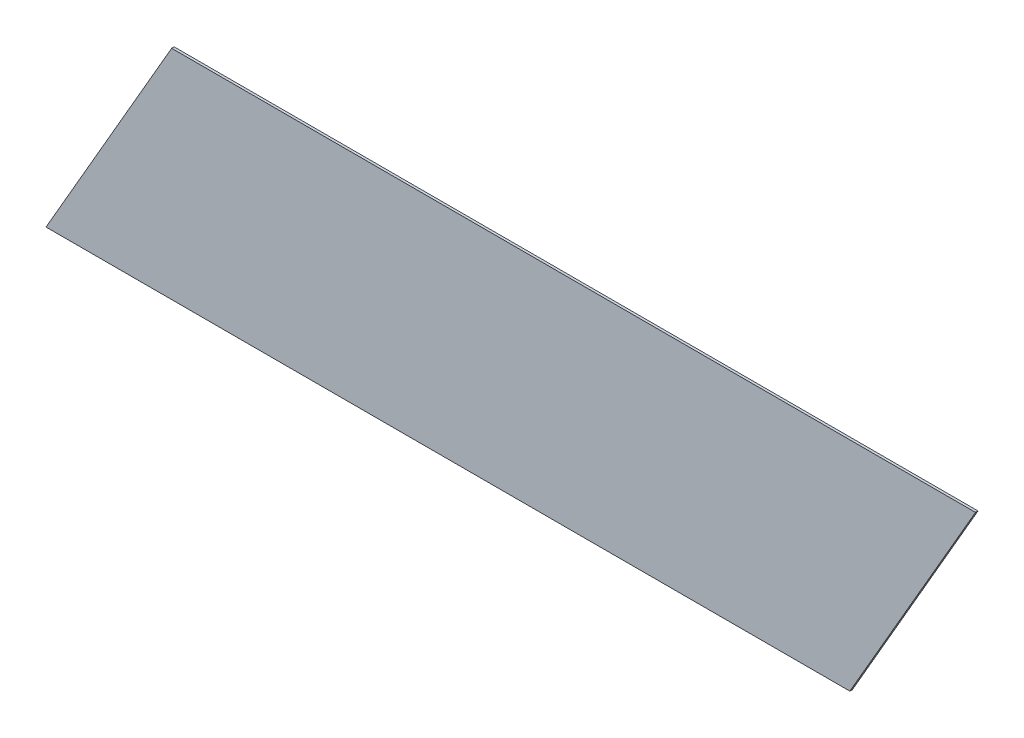
ISO-10303-21;
HEADER;
FILE_DESCRIPTION(('STEP AP214'),'2;1');
FILE_NAME('part.step','',(''),(''),'','','');
FILE_SCHEMA(('AUTOMOTIVE_DESIGN { 1 0 10303 214 1 1 1 1 }'));
ENDSEC;
DATA;
#1=APPLICATION_CONTEXT('core data for automotive mechanical design processes');
#2=APPLICATION_PROTOCOL_DEFINITION('international standard','automotive_design',2000,#1);
#3=PRODUCT_CONTEXT('',#1,'mechanical');
#4=PRODUCT('Part','Part','',(#3));
#5=PRODUCT_RELATED_PRODUCT_CATEGORY('part','',(#4));
#6=PRODUCT_DEFINITION_FORMATION('','',#4);
#7=PRODUCT_DEFINITION_CONTEXT('part definition',#1,'design');
#8=PRODUCT_DEFINITION('design','',#6,#7);
#9=PRODUCT_DEFINITION_SHAPE('','',#8);
#10=(LENGTH_UNIT() NAMED_UNIT(*) SI_UNIT(.MILLI.,.METRE.));
#11=(NAMED_UNIT(*) PLANE_ANGLE_UNIT() SI_UNIT($,.RADIAN.));
#12=(NAMED_UNIT(*) SI_UNIT($,.STERADIAN.) SOLID_ANGLE_UNIT());
#13=UNCERTAINTY_MEASURE_WITH_UNIT(LENGTH_MEASURE(1.E-05),#10,'distance_accuracy_value','');
#14=(GEOMETRIC_REPRESENTATION_CONTEXT(3) GLOBAL_UNCERTAINTY_ASSIGNED_CONTEXT((#13)) GLOBAL_UNIT_ASSIGNED_CONTEXT((#10,
#11,#12)) REPRESENTATION_CONTEXT('',''));
#15=CARTESIAN_POINT('',(0.,0.,0.));
#16=DIRECTION('',(0.,0.,1.));
#17=DIRECTION('',(1.,0.,0.));
#18=AXIS2_PLACEMENT_3D('',#15,#16,#17);
#19=CARTESIAN_POINT('',(65.,0.,0.2));
#20=DIRECTION('',(0.,1.,0.));
#21=DIRECTION('',(-1.,0.,0.));
#22=AXIS2_PLACEMENT_3D('',#19,#20,#21);
#23=PLANE('',#22);
#24=DIRECTION('',(1.,0.,0.));
#25=VECTOR('',#24,1.);
#26=CARTESIAN_POINT('',(65.,0.,0.));
#27=LINE('',#26,#25);
#28=CARTESIAN_POINT('',(0.,0.,0.));
#29=VERTEX_POINT('',#28);
#30=CARTESIAN_POINT('',(65.,0.,0.));
#31=VERTEX_POINT('',#30);
#32=EDGE_CURVE('E102',#29,#31,#27,.T.);
#33=ORIENTED_EDGE('',*,*,#32,.T.);
#34=DIRECTION('',(0.,0.,-1.));
#35=VECTOR('',#34,1.);
#36=CARTESIAN_POINT('',(65.,0.,0.2));
#37=LINE('',#36,#35);
#38=CARTESIAN_POINT('',(65.,0.,0.2));
#39=VERTEX_POINT('',#38);
#40=EDGE_CURVE('E11',#39,#31,#37,.T.);
#41=ORIENTED_EDGE('',*,*,#40,.F.);
#42=DIRECTION('',(1.,0.,0.));
#43=VECTOR('',#42,1.);
#44=CARTESIAN_POINT('',(65.,0.,0.2));
#45=LINE('',#44,#43);
#46=CARTESIAN_POINT('',(0.,0.,0.2));
#47=VERTEX_POINT('',#46);
#48=EDGE_CURVE('E90',#47,#39,#45,.T.);
#49=ORIENTED_EDGE('',*,*,#48,.F.);
#50=DIRECTION('',(0.,0.,-1.));
#51=VECTOR('',#50,1.);
#52=CARTESIAN_POINT('',(0.,0.,0.2));
#53=LINE('',#52,#51);
#54=EDGE_CURVE('E98',#47,#29,#53,.T.);
#55=ORIENTED_EDGE('',*,*,#54,.T.);
#56=EDGE_LOOP('',(#33,#41,#49,#55));
#57=FACE_BOUND('',#56,.T.);
#58=ADVANCED_FACE('F39',(#57),#23,.F.);
#59=CARTESIAN_POINT('',(75.1613647377375,17.6,0.2));
#60=DIRECTION('',(-0.866025403784436,0.500000000000004,0.));
#61=DIRECTION('',(-0.500000000000004,-0.866025403784436,0.));
#62=AXIS2_PLACEMENT_3D('',#59,#60,#61);
#63=PLANE('',#62);
#64=DIRECTION('',(0.500000000000004,0.866025403784436,0.));
#65=VECTOR('',#64,1.);
#66=CARTESIAN_POINT('',(75.1613647377375,17.6,0.));
#67=LINE('',#66,#65);
#68=CARTESIAN_POINT('',(75.1613647377375,17.6,0.));
#69=VERTEX_POINT('',#68);
#70=EDGE_CURVE('E94',#31,#69,#67,.T.);
#71=ORIENTED_EDGE('',*,*,#70,.T.);
#72=DIRECTION('',(0.,0.,-1.));
#73=VECTOR('',#72,1.);
#74=CARTESIAN_POINT('',(75.1613647377375,17.6,0.2));
#75=LINE('',#74,#73);
#76=CARTESIAN_POINT('',(75.1613647377375,17.6,0.2));
#77=VERTEX_POINT('',#76);
#78=EDGE_CURVE('E47',#77,#69,#75,.T.);
#79=ORIENTED_EDGE('',*,*,#78,.F.);
#80=DIRECTION('',(0.500000000000004,0.866025403784436,0.));
#81=VECTOR('',#80,1.);
#82=CARTESIAN_POINT('',(75.1613647377375,17.6,0.2));
#83=LINE('',#82,#81);
#84=EDGE_CURVE('E85',#39,#77,#83,.T.);
#85=ORIENTED_EDGE('',*,*,#84,.F.);
#86=ORIENTED_EDGE('',*,*,#40,.T.);
#87=EDGE_LOOP('',(#71,#79,#85,#86));
#88=FACE_BOUND('',#87,.T.);
#89=ADVANCED_FACE('F93',(#88),#63,.F.);
#90=CARTESIAN_POINT('',(10.1613647377375,17.6,0.2));
#91=DIRECTION('',(0.,-1.,0.));
#92=DIRECTION('',(0.,0.,-1.));
#93=AXIS2_PLACEMENT_3D('',#90,#91,#92);
#94=PLANE('',#93);
#95=DIRECTION('',(-1.,0.,0.));
#96=VECTOR('',#95,1.);
#97=CARTESIAN_POINT('',(10.1613647377375,17.6,0.));
#98=LINE('',#97,#96);
#99=CARTESIAN_POINT('',(10.1613647377375,17.6,0.));
#100=VERTEX_POINT('',#99);
#101=EDGE_CURVE('E72',#69,#100,#98,.T.);
#102=ORIENTED_EDGE('',*,*,#101,.T.);
#103=DIRECTION('',(0.,0.,-1.));
#104=VECTOR('',#103,1.);
#105=CARTESIAN_POINT('',(10.1613647377375,17.6,0.2));
#106=LINE('',#105,#104);
#107=CARTESIAN_POINT('',(10.1613647377375,17.6,0.2));
#108=VERTEX_POINT('',#107);
#109=EDGE_CURVE('E95',#108,#100,#106,.T.);
#110=ORIENTED_EDGE('',*,*,#109,.F.);
#111=DIRECTION('',(-1.,0.,0.));
#112=VECTOR('',#111,1.);
#113=CARTESIAN_POINT('',(10.1613647377375,17.6,0.2));
#114=LINE('',#113,#112);
#115=EDGE_CURVE('E88',#77,#108,#114,.T.);
#116=ORIENTED_EDGE('',*,*,#115,.F.);
#117=ORIENTED_EDGE('',*,*,#78,.T.);
#118=EDGE_LOOP('',(#102,#110,#116,#117));
#119=FACE_BOUND('',#118,.T.);
#120=ADVANCED_FACE('F96',(#119),#94,.F.);
#121=CARTESIAN_POINT('',(0.,0.,0.2));
#122=DIRECTION('',(0.866025403784436,-0.500000000000004,0.));
#123=DIRECTION('',(0.500000000000004,0.866025403784436,0.));
#124=AXIS2_PLACEMENT_3D('',#121,#122,#123);
#125=PLANE('',#124);
#126=DIRECTION('',(-0.500000000000004,-0.866025403784436,0.));
#127=VECTOR('',#126,1.);
#128=CARTESIAN_POINT('',(0.,0.,0.));
#129=LINE('',#128,#127);
#130=EDGE_CURVE('E78',#100,#29,#129,.T.);
#131=ORIENTED_EDGE('',*,*,#130,.T.);
#132=ORIENTED_EDGE('',*,*,#54,.F.);
#133=DIRECTION('',(-0.500000000000004,-0.866025403784436,0.));
#134=VECTOR('',#133,1.);
#135=CARTESIAN_POINT('',(0.,0.,0.2));
#136=LINE('',#135,#134);
#137=EDGE_CURVE('E55',#108,#47,#136,.T.);
#138=ORIENTED_EDGE('',*,*,#137,.F.);
#139=ORIENTED_EDGE('',*,*,#109,.T.);
#140=EDGE_LOOP('',(#131,#132,#138,#139));
#141=FACE_BOUND('',#140,.T.);
#142=ADVANCED_FACE('F109',(#141),#125,.F.);
#143=CARTESIAN_POINT('',(0.,0.,0.2));
#144=DIRECTION('',(0.,0.,-1.));
#145=DIRECTION('',(-1.,0.,0.));
#146=AXIS2_PLACEMENT_3D('',#143,#144,#145);
#147=PLANE('',#146);
#148=ORIENTED_EDGE('',*,*,#48,.T.);
#149=ORIENTED_EDGE('',*,*,#84,.T.);
#150=ORIENTED_EDGE('',*,*,#115,.T.);
#151=ORIENTED_EDGE('',*,*,#137,.T.);
#152=EDGE_LOOP('',(#148,#149,#150,#151));
#153=FACE_BOUND('',#152,.T.);
#154=ADVANCED_FACE('F86',(#153),#147,.F.);
#155=CARTESIAN_POINT('',(0.,0.,0.));
#156=DIRECTION('',(0.,0.,-1.));
#157=DIRECTION('',(-1.,0.,0.));
#158=AXIS2_PLACEMENT_3D('',#155,#156,#157);
#159=PLANE('',#158);
#160=ORIENTED_EDGE('',*,*,#32,.F.);
#161=ORIENTED_EDGE('',*,*,#130,.F.);
#162=ORIENTED_EDGE('',*,*,#101,.F.);
#163=ORIENTED_EDGE('',*,*,#70,.F.);
#164=EDGE_LOOP('',(#160,#161,#162,#163));
#165=FACE_BOUND('',#164,.T.);
#166=ADVANCED_FACE('F112',(#165),#159,.T.);
#167=CLOSED_SHELL('',(#58,#89,#120,#142,#154,#166));
#168=MANIFOLD_SOLID_BREP('B2',#167);
#169=ADVANCED_BREP_SHAPE_REPRESENTATION('',(#18,#168),#14);
#170=SHAPE_DEFINITION_REPRESENTATION(#9,#169);
ENDSEC;
END-ISO-10303-21;
